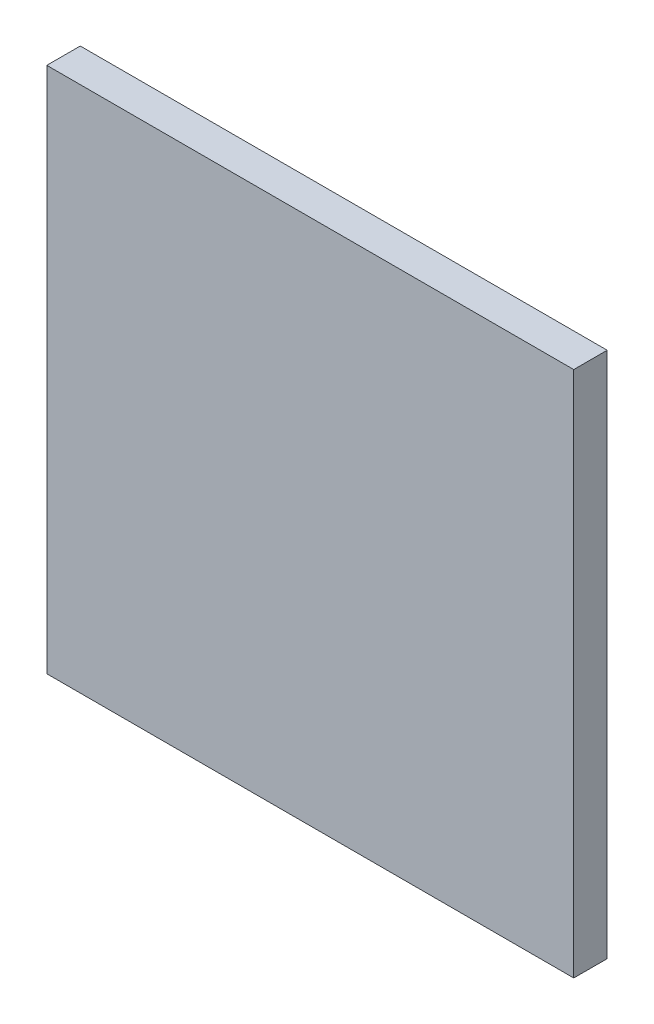
ISO-10303-21;
HEADER;
FILE_DESCRIPTION(('STEP AP214'),'2;1');
FILE_NAME('part.step','',(''),(''),'','','');
FILE_SCHEMA(('AUTOMOTIVE_DESIGN { 1 0 10303 214 1 1 1 1 }'));
ENDSEC;
DATA;
#1=APPLICATION_CONTEXT('core data for automotive mechanical design processes');
#2=APPLICATION_PROTOCOL_DEFINITION('international standard','automotive_design',2000,#1);
#3=PRODUCT_CONTEXT('',#1,'mechanical');
#4=PRODUCT('Part','Part','',(#3));
#5=PRODUCT_RELATED_PRODUCT_CATEGORY('part','',(#4));
#6=PRODUCT_DEFINITION_FORMATION('','',#4);
#7=PRODUCT_DEFINITION_CONTEXT('part definition',#1,'design');
#8=PRODUCT_DEFINITION('design','',#6,#7);
#9=PRODUCT_DEFINITION_SHAPE('','',#8);
#10=(LENGTH_UNIT() NAMED_UNIT(*) SI_UNIT(.MILLI.,.METRE.));
#11=(NAMED_UNIT(*) PLANE_ANGLE_UNIT() SI_UNIT($,.RADIAN.));
#12=(NAMED_UNIT(*) SI_UNIT($,.STERADIAN.) SOLID_ANGLE_UNIT());
#13=UNCERTAINTY_MEASURE_WITH_UNIT(LENGTH_MEASURE(1.E-05),#10,'distance_accuracy_value','');
#14=(GEOMETRIC_REPRESENTATION_CONTEXT(3) GLOBAL_UNCERTAINTY_ASSIGNED_CONTEXT((#13)) GLOBAL_UNIT_ASSIGNED_CONTEXT((#10,
#11,#12)) REPRESENTATION_CONTEXT('',''));
#15=CARTESIAN_POINT('',(0.,0.,0.));
#16=DIRECTION('',(0.,0.,1.));
#17=DIRECTION('',(1.,0.,0.));
#18=AXIS2_PLACEMENT_3D('',#15,#16,#17);
#19=CARTESIAN_POINT('',(-43.2835820895522,26.181592039801,6.35));
#20=DIRECTION('',(1.,0.,0.));
#21=DIRECTION('',(0.,1.,0.));
#22=AXIS2_PLACEMENT_3D('',#19,#20,#21);
#23=PLANE('',#22);
#24=DIRECTION('',(0.,-1.,0.));
#25=VECTOR('',#24,1.);
#26=CARTESIAN_POINT('',(-43.2835820895522,26.181592039801,0.));
#27=LINE('',#26,#25);
#28=CARTESIAN_POINT('',(-43.2835820895522,26.181592039801,0.));
#29=VERTEX_POINT('',#28);
#30=CARTESIAN_POINT('',(-43.2835820895522,-73.818407960199,0.));
#31=VERTEX_POINT('',#30);
#32=EDGE_CURVE('E106',#29,#31,#27,.T.);
#33=ORIENTED_EDGE('',*,*,#32,.T.);
#34=DIRECTION('',(0.,0.,-1.));
#35=VECTOR('',#34,1.);
#36=CARTESIAN_POINT('',(-43.2835820895522,-73.818407960199,6.35));
#37=LINE('',#36,#35);
#38=CARTESIAN_POINT('',(-43.2835820895522,-73.818407960199,6.35));
#39=VERTEX_POINT('',#38);
#40=EDGE_CURVE('E11',#39,#31,#37,.T.);
#41=ORIENTED_EDGE('',*,*,#40,.F.);
#42=DIRECTION('',(0.,-1.,0.));
#43=VECTOR('',#42,1.);
#44=CARTESIAN_POINT('',(-43.2835820895522,26.181592039801,6.35));
#45=LINE('',#44,#43);
#46=CARTESIAN_POINT('',(-43.2835820895522,26.181592039801,6.35));
#47=VERTEX_POINT('',#46);
#48=EDGE_CURVE('E94',#47,#39,#45,.T.);
#49=ORIENTED_EDGE('',*,*,#48,.F.);
#50=DIRECTION('',(0.,0.,-1.));
#51=VECTOR('',#50,1.);
#52=CARTESIAN_POINT('',(-43.2835820895522,26.181592039801,6.35));
#53=LINE('',#52,#51);
#54=EDGE_CURVE('E102',#47,#29,#53,.T.);
#55=ORIENTED_EDGE('',*,*,#54,.T.);
#56=EDGE_LOOP('',(#33,#41,#49,#55));
#57=FACE_BOUND('',#56,.T.);
#58=ADVANCED_FACE('F43',(#57),#23,.F.);
#59=CARTESIAN_POINT('',(-43.2835820895522,-73.818407960199,6.35));
#60=DIRECTION('',(0.,1.,0.));
#61=DIRECTION('',(0.,0.,1.));
#62=AXIS2_PLACEMENT_3D('',#59,#60,#61);
#63=PLANE('',#62);
#64=DIRECTION('',(1.,0.,0.));
#65=VECTOR('',#64,1.);
#66=CARTESIAN_POINT('',(-43.2835820895522,-73.818407960199,0.));
#67=LINE('',#66,#65);
#68=CARTESIAN_POINT('',(56.7164179104478,-73.818407960199,0.));
#69=VERTEX_POINT('',#68);
#70=EDGE_CURVE('E98',#31,#69,#67,.T.);
#71=ORIENTED_EDGE('',*,*,#70,.T.);
#72=DIRECTION('',(0.,0.,-1.));
#73=VECTOR('',#72,1.);
#74=CARTESIAN_POINT('',(56.7164179104478,-73.818407960199,6.35));
#75=LINE('',#74,#73);
#76=CARTESIAN_POINT('',(56.7164179104478,-73.818407960199,6.35));
#77=VERTEX_POINT('',#76);
#78=EDGE_CURVE('E51',#77,#69,#75,.T.);
#79=ORIENTED_EDGE('',*,*,#78,.F.);
#80=DIRECTION('',(1.,0.,0.));
#81=VECTOR('',#80,1.);
#82=CARTESIAN_POINT('',(-43.2835820895522,-73.818407960199,6.35));
#83=LINE('',#82,#81);
#84=EDGE_CURVE('E89',#39,#77,#83,.T.);
#85=ORIENTED_EDGE('',*,*,#84,.F.);
#86=ORIENTED_EDGE('',*,*,#40,.T.);
#87=EDGE_LOOP('',(#71,#79,#85,#86));
#88=FACE_BOUND('',#87,.T.);
#89=ADVANCED_FACE('F97',(#88),#63,.F.);
#90=CARTESIAN_POINT('',(56.7164179104478,26.181592039801,6.35));
#91=DIRECTION('',(-1.,0.,0.));
#92=DIRECTION('',(0.,-1.,0.));
#93=AXIS2_PLACEMENT_3D('',#90,#91,#92);
#94=PLANE('',#93);
#95=DIRECTION('',(0.,1.,0.));
#96=VECTOR('',#95,1.);
#97=CARTESIAN_POINT('',(56.7164179104478,26.181592039801,0.));
#98=LINE('',#97,#96);
#99=CARTESIAN_POINT('',(56.7164179104478,26.181592039801,0.));
#100=VERTEX_POINT('',#99);
#101=EDGE_CURVE('E76',#69,#100,#98,.T.);
#102=ORIENTED_EDGE('',*,*,#101,.T.);
#103=DIRECTION('',(0.,0.,-1.));
#104=VECTOR('',#103,1.);
#105=CARTESIAN_POINT('',(56.7164179104478,26.181592039801,6.35));
#106=LINE('',#105,#104);
#107=CARTESIAN_POINT('',(56.7164179104478,26.181592039801,6.35));
#108=VERTEX_POINT('',#107);
#109=EDGE_CURVE('E99',#108,#100,#106,.T.);
#110=ORIENTED_EDGE('',*,*,#109,.F.);
#111=DIRECTION('',(0.,1.,0.));
#112=VECTOR('',#111,1.);
#113=CARTESIAN_POINT('',(56.7164179104478,26.181592039801,6.35));
#114=LINE('',#113,#112);
#115=EDGE_CURVE('E92',#77,#108,#114,.T.);
#116=ORIENTED_EDGE('',*,*,#115,.F.);
#117=ORIENTED_EDGE('',*,*,#78,.T.);
#118=EDGE_LOOP('',(#102,#110,#116,#117));
#119=FACE_BOUND('',#118,.T.);
#120=ADVANCED_FACE('F100',(#119),#94,.F.);
#121=CARTESIAN_POINT('',(-43.2835820895522,26.181592039801,6.35));
#122=DIRECTION('',(0.,-1.,0.));
#123=DIRECTION('',(0.,0.,-1.));
#124=AXIS2_PLACEMENT_3D('',#121,#122,#123);
#125=PLANE('',#124);
#126=DIRECTION('',(-1.,0.,0.));
#127=VECTOR('',#126,1.);
#128=CARTESIAN_POINT('',(-43.2835820895522,26.181592039801,0.));
#129=LINE('',#128,#127);
#130=EDGE_CURVE('E82',#100,#29,#129,.T.);
#131=ORIENTED_EDGE('',*,*,#130,.T.);
#132=ORIENTED_EDGE('',*,*,#54,.F.);
#133=DIRECTION('',(-1.,0.,0.));
#134=VECTOR('',#133,1.);
#135=CARTESIAN_POINT('',(-43.2835820895522,26.181592039801,6.35));
#136=LINE('',#135,#134);
#137=EDGE_CURVE('E59',#108,#47,#136,.T.);
#138=ORIENTED_EDGE('',*,*,#137,.F.);
#139=ORIENTED_EDGE('',*,*,#109,.T.);
#140=EDGE_LOOP('',(#131,#132,#138,#139));
#141=FACE_BOUND('',#140,.T.);
#142=ADVANCED_FACE('F113',(#141),#125,.F.);
#143=CARTESIAN_POINT('',(0.,0.,6.35));
#144=DIRECTION('',(0.,0.,1.));
#145=DIRECTION('',(1.,0.,0.));
#146=AXIS2_PLACEMENT_3D('',#143,#144,#145);
#147=PLANE('',#146);
#148=ORIENTED_EDGE('',*,*,#48,.T.);
#149=ORIENTED_EDGE('',*,*,#84,.T.);
#150=ORIENTED_EDGE('',*,*,#115,.T.);
#151=ORIENTED_EDGE('',*,*,#137,.T.);
#152=EDGE_LOOP('',(#148,#149,#150,#151));
#153=FACE_BOUND('',#152,.T.);
#154=ADVANCED_FACE('F90',(#153),#147,.T.);
#155=CARTESIAN_POINT('',(0.,0.,0.));
#156=DIRECTION('',(0.,0.,1.));
#157=DIRECTION('',(1.,0.,0.));
#158=AXIS2_PLACEMENT_3D('',#155,#156,#157);
#159=PLANE('',#158);
#160=ORIENTED_EDGE('',*,*,#32,.F.);
#161=ORIENTED_EDGE('',*,*,#130,.F.);
#162=ORIENTED_EDGE('',*,*,#101,.F.);
#163=ORIENTED_EDGE('',*,*,#70,.F.);
#164=EDGE_LOOP('',(#160,#161,#162,#163));
#165=FACE_BOUND('',#164,.T.);
#166=ADVANCED_FACE('F116',(#165),#159,.F.);
#167=CLOSED_SHELL('',(#58,#89,#120,#142,#154,#166));
#168=MANIFOLD_SOLID_BREP('B2',#167);
#169=ADVANCED_BREP_SHAPE_REPRESENTATION('',(#18,#168),#14);
#170=SHAPE_DEFINITION_REPRESENTATION(#9,#169);
ENDSEC;
END-ISO-10303-21;
